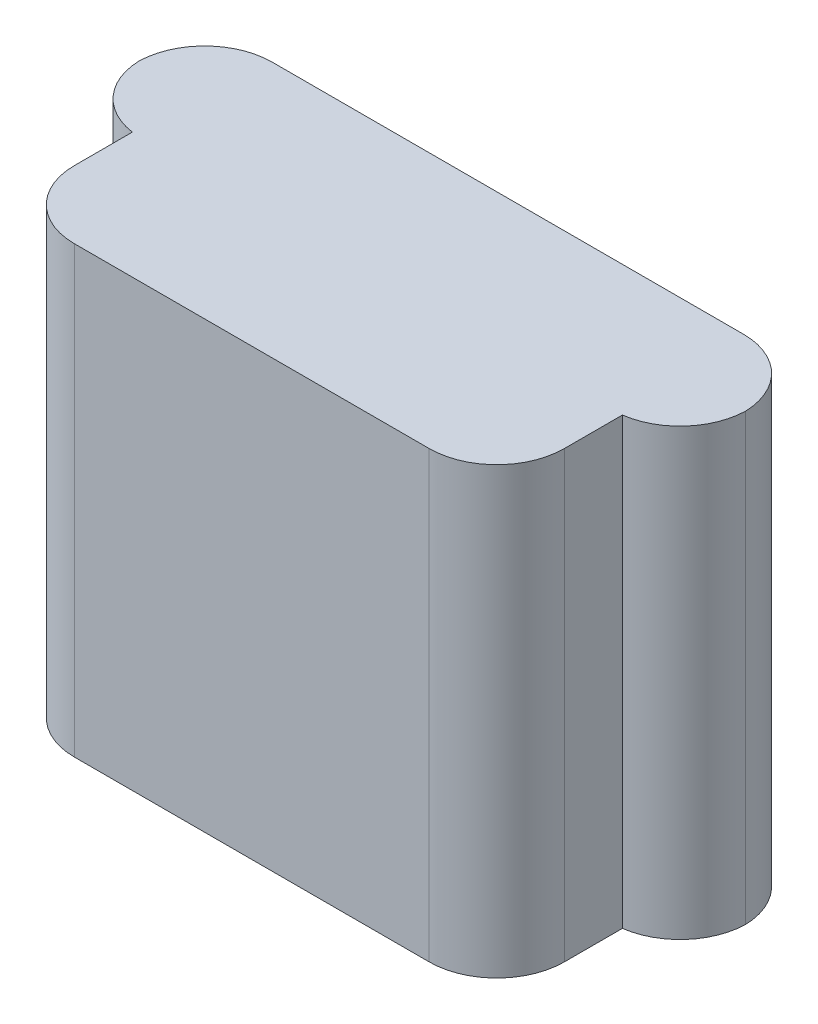
ISO-10303-21;
HEADER;
FILE_DESCRIPTION(('STEP AP214'),'2;1');
FILE_NAME('part.step','',(''),(''),'','','');
FILE_SCHEMA(('AUTOMOTIVE_DESIGN { 1 0 10303 214 1 1 1 1 }'));
ENDSEC;
DATA;
#1=APPLICATION_CONTEXT('core data for automotive mechanical design processes');
#2=APPLICATION_PROTOCOL_DEFINITION('international standard','automotive_design',2000,#1);
#3=PRODUCT_CONTEXT('',#1,'mechanical');
#4=PRODUCT('Part','Part','',(#3));
#5=PRODUCT_RELATED_PRODUCT_CATEGORY('part','',(#4));
#6=PRODUCT_DEFINITION_FORMATION('','',#4);
#7=PRODUCT_DEFINITION_CONTEXT('part definition',#1,'design');
#8=PRODUCT_DEFINITION('design','',#6,#7);
#9=PRODUCT_DEFINITION_SHAPE('','',#8);
#10=(LENGTH_UNIT() NAMED_UNIT(*) SI_UNIT(.MILLI.,.METRE.));
#11=(NAMED_UNIT(*) PLANE_ANGLE_UNIT() SI_UNIT($,.RADIAN.));
#12=(NAMED_UNIT(*) SI_UNIT($,.STERADIAN.) SOLID_ANGLE_UNIT());
#13=UNCERTAINTY_MEASURE_WITH_UNIT(LENGTH_MEASURE(1.E-05),#10,'distance_accuracy_value','');
#14=(GEOMETRIC_REPRESENTATION_CONTEXT(3) GLOBAL_UNCERTAINTY_ASSIGNED_CONTEXT((#13)) GLOBAL_UNIT_ASSIGNED_CONTEXT((#10,
#11,#12)) REPRESENTATION_CONTEXT('',''));
#15=CARTESIAN_POINT('',(0.,0.,0.));
#16=DIRECTION('',(0.,0.,1.));
#17=DIRECTION('',(1.,0.,0.));
#18=AXIS2_PLACEMENT_3D('',#15,#16,#17);
#19=CARTESIAN_POINT('',(45.6184,66.8782,-0.7366));
#20=DIRECTION('',(0.,1.,0.));
#21=DIRECTION('',(-1.,0.,0.));
#22=AXIS2_PLACEMENT_3D('',#19,#20,#21);
#23=PLANE('',#22);
#24=DIRECTION('',(-1.,0.,0.));
#25=VECTOR('',#24,1.);
#26=CARTESIAN_POINT('',(45.6184,66.8782,-0.7366));
#27=LINE('',#26,#25);
#28=CARTESIAN_POINT('',(35.4584,66.8782,-0.7366));
#29=VERTEX_POINT('',#28);
#30=CARTESIAN_POINT('',(-35.4584,66.8782,-0.7366));
#31=VERTEX_POINT('',#30);
#32=EDGE_CURVE('E200',#29,#31,#27,.T.);
#33=ORIENTED_EDGE('',*,*,#32,.T.);
#34=CARTESIAN_POINT('',(-35.4584,66.8782,9.42339999999997));
#35=DIRECTION('',(0.,1.,0.));
#36=DIRECTION('',(-1.,0.,0.));
#37=AXIS2_PLACEMENT_3D('',#34,#35,#36);
#38=CIRCLE('',#37,10.16);
#39=CARTESIAN_POINT('',(-45.6141265609793,66.8782,9.12875102474299));
#40=VERTEX_POINT('',#39);
#41=EDGE_CURVE('E146',#31,#40,#38,.T.);
#42=ORIENTED_EDGE('',*,*,#41,.T.);
#43=CARTESIAN_POINT('',(-35.4584,66.8782,8.834102049486));
#44=DIRECTION('',(0.,1.,0.));
#45=DIRECTION('',(-1.,0.,0.));
#46=AXIS2_PLACEMENT_3D('',#43,#44,#45);
#47=CIRCLE('',#46,10.16);
#48=CARTESIAN_POINT('',(-36.8554,66.8782,18.8976));
#49=VERTEX_POINT('',#48);
#50=EDGE_CURVE('E139',#40,#49,#47,.T.);
#51=ORIENTED_EDGE('',*,*,#50,.T.);
#52=DIRECTION('',(0.,0.,1.));
#53=VECTOR('',#52,1.);
#54=CARTESIAN_POINT('',(-36.8554,66.8782,18.8976));
#55=LINE('',#54,#53);
#56=CARTESIAN_POINT('',(-36.8554,66.8782,27.6352));
#57=VERTEX_POINT('',#56);
#58=EDGE_CURVE('E182',#49,#57,#55,.T.);
#59=ORIENTED_EDGE('',*,*,#58,.T.);
#60=CARTESIAN_POINT('',(-26.6954,66.8782,27.6352));
#61=DIRECTION('',(0.,1.,0.));
#62=DIRECTION('',(-1.,0.,0.));
#63=AXIS2_PLACEMENT_3D('',#60,#61,#62);
#64=CIRCLE('',#63,10.16);
#65=CARTESIAN_POINT('',(-26.6954,66.8782,37.7952));
#66=VERTEX_POINT('',#65);
#67=EDGE_CURVE('E141',#57,#66,#64,.T.);
#68=ORIENTED_EDGE('',*,*,#67,.T.);
#69=DIRECTION('',(-1.,0.,0.));
#70=VECTOR('',#69,1.);
#71=CARTESIAN_POINT('',(45.6184,66.8782,37.7952));
#72=LINE('',#71,#70);
#73=CARTESIAN_POINT('',(26.6954,66.8782,37.7952));
#74=VERTEX_POINT('',#73);
#75=EDGE_CURVE('E187',#74,#66,#72,.T.);
#76=ORIENTED_EDGE('',*,*,#75,.F.);
#77=CARTESIAN_POINT('',(26.6954,66.8782,27.6352));
#78=DIRECTION('',(0.,1.,0.));
#79=DIRECTION('',(-1.,0.,0.));
#80=AXIS2_PLACEMENT_3D('',#77,#78,#79);
#81=CIRCLE('',#80,10.16);
#82=CARTESIAN_POINT('',(36.8554,66.8782,27.6352));
#83=VERTEX_POINT('',#82);
#84=EDGE_CURVE('E132',#74,#83,#81,.T.);
#85=ORIENTED_EDGE('',*,*,#84,.T.);
#86=DIRECTION('',(0.,0.,1.));
#87=VECTOR('',#86,1.);
#88=CARTESIAN_POINT('',(36.8554,66.8782,18.8976));
#89=LINE('',#88,#87);
#90=CARTESIAN_POINT('',(36.8554,66.8782,18.8976));
#91=VERTEX_POINT('',#90);
#92=EDGE_CURVE('E119',#91,#83,#89,.T.);
#93=ORIENTED_EDGE('',*,*,#92,.F.);
#94=CARTESIAN_POINT('',(35.4584,66.8782,8.834102049486));
#95=DIRECTION('',(0.,1.,0.));
#96=DIRECTION('',(-1.,0.,0.));
#97=AXIS2_PLACEMENT_3D('',#94,#95,#96);
#98=CIRCLE('',#97,10.16);
#99=CARTESIAN_POINT('',(45.6141265609793,66.8782,9.12875102474311));
#100=VERTEX_POINT('',#99);
#101=EDGE_CURVE('E129',#91,#100,#98,.T.);
#102=ORIENTED_EDGE('',*,*,#101,.T.);
#103=CARTESIAN_POINT('',(35.4584,66.8782,9.42339999999997));
#104=DIRECTION('',(0.,1.,0.));
#105=DIRECTION('',(-1.,0.,0.));
#106=AXIS2_PLACEMENT_3D('',#103,#104,#105);
#107=CIRCLE('',#106,10.16);
#108=EDGE_CURVE('E137',#100,#29,#107,.T.);
#109=ORIENTED_EDGE('',*,*,#108,.T.);
#110=EDGE_LOOP('',(#33,#42,#51,#59,#68,#76,#85,#93,#102,#109));
#111=FACE_BOUND('',#110,.T.);
#112=ADVANCED_FACE('F36',(#111),#23,.T.);
#113=CARTESIAN_POINT('',(-45.6184,0.,-0.7366));
#114=DIRECTION('',(0.,-1.,0.));
#115=DIRECTION('',(1.,0.,0.));
#116=AXIS2_PLACEMENT_3D('',#113,#114,#115);
#117=PLANE('',#116);
#118=CARTESIAN_POINT('',(-35.4584,0.,8.834102049486));
#119=DIRECTION('',(0.,-1.,0.));
#120=DIRECTION('',(1.,0.,0.));
#121=AXIS2_PLACEMENT_3D('',#118,#119,#120);
#122=CIRCLE('',#121,10.16);
#123=CARTESIAN_POINT('',(-36.8554,0.,18.8976));
#124=VERTEX_POINT('',#123);
#125=CARTESIAN_POINT('',(-45.6141265609793,0.,9.12875102474299));
#126=VERTEX_POINT('',#125);
#127=EDGE_CURVE('E53',#124,#126,#122,.T.);
#128=ORIENTED_EDGE('',*,*,#127,.T.);
#129=CARTESIAN_POINT('',(-35.4584,0.,9.42339999999997));
#130=DIRECTION('',(0.,-1.,0.));
#131=DIRECTION('',(1.,0.,0.));
#132=AXIS2_PLACEMENT_3D('',#129,#130,#131);
#133=CIRCLE('',#132,10.16);
#134=CARTESIAN_POINT('',(-35.4584,0.,-0.7366));
#135=VERTEX_POINT('',#134);
#136=EDGE_CURVE('E162',#126,#135,#133,.T.);
#137=ORIENTED_EDGE('',*,*,#136,.T.);
#138=DIRECTION('',(1.,0.,0.));
#139=VECTOR('',#138,1.);
#140=CARTESIAN_POINT('',(-45.6184,0.,-0.7366));
#141=LINE('',#140,#139);
#142=CARTESIAN_POINT('',(35.4584,0.,-0.7366));
#143=VERTEX_POINT('',#142);
#144=EDGE_CURVE('E198',#135,#143,#141,.T.);
#145=ORIENTED_EDGE('',*,*,#144,.T.);
#146=CARTESIAN_POINT('',(35.4584,0.,9.42339999999997));
#147=DIRECTION('',(0.,-1.,0.));
#148=DIRECTION('',(1.,0.,0.));
#149=AXIS2_PLACEMENT_3D('',#146,#147,#148);
#150=CIRCLE('',#149,10.16);
#151=CARTESIAN_POINT('',(45.6141265609793,0.,9.12875102474299));
#152=VERTEX_POINT('',#151);
#153=EDGE_CURVE('E60',#143,#152,#150,.T.);
#154=ORIENTED_EDGE('',*,*,#153,.T.);
#155=CARTESIAN_POINT('',(35.4584,0.,8.834102049486));
#156=DIRECTION('',(0.,-1.,0.));
#157=DIRECTION('',(1.,0.,0.));
#158=AXIS2_PLACEMENT_3D('',#155,#156,#157);
#159=CIRCLE('',#158,10.16);
#160=CARTESIAN_POINT('',(36.8554,0.,18.8976));
#161=VERTEX_POINT('',#160);
#162=EDGE_CURVE('E158',#152,#161,#159,.T.);
#163=ORIENTED_EDGE('',*,*,#162,.T.);
#164=DIRECTION('',(0.,0.,1.));
#165=VECTOR('',#164,1.);
#166=CARTESIAN_POINT('',(36.8554,0.,18.8976));
#167=LINE('',#166,#165);
#168=CARTESIAN_POINT('',(36.8554,0.,27.6352));
#169=VERTEX_POINT('',#168);
#170=EDGE_CURVE('E122',#161,#169,#167,.T.);
#171=ORIENTED_EDGE('',*,*,#170,.T.);
#172=CARTESIAN_POINT('',(26.6954,0.,27.6352));
#173=DIRECTION('',(0.,-1.,0.));
#174=DIRECTION('',(1.,0.,0.));
#175=AXIS2_PLACEMENT_3D('',#172,#173,#174);
#176=CIRCLE('',#175,10.16);
#177=CARTESIAN_POINT('',(26.6954,0.,37.7952));
#178=VERTEX_POINT('',#177);
#179=EDGE_CURVE('E156',#169,#178,#176,.T.);
#180=ORIENTED_EDGE('',*,*,#179,.T.);
#181=DIRECTION('',(1.,0.,0.));
#182=VECTOR('',#181,1.);
#183=CARTESIAN_POINT('',(-45.6184,0.,37.7952));
#184=LINE('',#183,#182);
#185=CARTESIAN_POINT('',(-26.6954,0.,37.7952));
#186=VERTEX_POINT('',#185);
#187=EDGE_CURVE('E191',#186,#178,#184,.T.);
#188=ORIENTED_EDGE('',*,*,#187,.F.);
#189=CARTESIAN_POINT('',(-26.6954,0.,27.6352));
#190=DIRECTION('',(0.,-1.,0.));
#191=DIRECTION('',(1.,0.,0.));
#192=AXIS2_PLACEMENT_3D('',#189,#190,#191);
#193=CIRCLE('',#192,10.16);
#194=CARTESIAN_POINT('',(-36.8554,0.,27.6352));
#195=VERTEX_POINT('',#194);
#196=EDGE_CURVE('E154',#186,#195,#193,.T.);
#197=ORIENTED_EDGE('',*,*,#196,.T.);
#198=DIRECTION('',(0.,0.,1.));
#199=VECTOR('',#198,1.);
#200=CARTESIAN_POINT('',(-36.8554,0.,18.8976));
#201=LINE('',#200,#199);
#202=EDGE_CURVE('E188',#124,#195,#201,.T.);
#203=ORIENTED_EDGE('',*,*,#202,.F.);
#204=EDGE_LOOP('',(#128,#137,#145,#154,#163,#171,#180,#188,#197,#203));
#205=FACE_BOUND('',#204,.T.);
#206=ADVANCED_FACE('F208',(#205),#117,.T.);
#207=CARTESIAN_POINT('',(0.,0.,37.7952));
#208=DIRECTION('',(0.,0.,1.));
#209=DIRECTION('',(1.,0.,0.));
#210=AXIS2_PLACEMENT_3D('',#207,#208,#209);
#211=PLANE('',#210);
#212=ORIENTED_EDGE('',*,*,#187,.T.);
#213=DIRECTION('',(0.,1.,0.));
#214=VECTOR('',#213,1.);
#215=CARTESIAN_POINT('',(26.6954,0.,37.7952));
#216=LINE('',#215,#214);
#217=EDGE_CURVE('E166',#178,#74,#216,.T.);
#218=ORIENTED_EDGE('',*,*,#217,.T.);
#219=ORIENTED_EDGE('',*,*,#75,.T.);
#220=DIRECTION('',(0.,1.,0.));
#221=VECTOR('',#220,1.);
#222=CARTESIAN_POINT('',(-26.6954,0.,37.7952));
#223=LINE('',#222,#221);
#224=EDGE_CURVE('E164',#66,#186,#223,.F.);
#225=ORIENTED_EDGE('',*,*,#224,.T.);
#226=EDGE_LOOP('',(#212,#218,#219,#225));
#227=FACE_BOUND('',#226,.T.);
#228=ADVANCED_FACE('F204',(#227),#211,.T.);
#229=CARTESIAN_POINT('',(0.,0.,-0.7366));
#230=DIRECTION('',(0.,0.,1.));
#231=DIRECTION('',(1.,0.,0.));
#232=AXIS2_PLACEMENT_3D('',#229,#230,#231);
#233=PLANE('',#232);
#234=ORIENTED_EDGE('',*,*,#32,.F.);
#235=DIRECTION('',(0.,1.,0.));
#236=VECTOR('',#235,1.);
#237=CARTESIAN_POINT('',(35.4584,0.,-0.7366));
#238=LINE('',#237,#236);
#239=EDGE_CURVE('E151',#29,#143,#238,.F.);
#240=ORIENTED_EDGE('',*,*,#239,.T.);
#241=ORIENTED_EDGE('',*,*,#144,.F.);
#242=DIRECTION('',(0.,-1.,0.));
#243=VECTOR('',#242,1.);
#244=CARTESIAN_POINT('',(-35.4584,66.8782,-0.7366));
#245=LINE('',#244,#243);
#246=EDGE_CURVE('E148',#135,#31,#245,.F.);
#247=ORIENTED_EDGE('',*,*,#246,.T.);
#248=EDGE_LOOP('',(#234,#240,#241,#247));
#249=FACE_BOUND('',#248,.T.);
#250=ADVANCED_FACE('F227',(#249),#233,.F.);
#251=CARTESIAN_POINT('',(-36.8554,66.8782,18.8976));
#252=DIRECTION('',(1.,0.,0.));
#253=DIRECTION('',(0.,1.,0.));
#254=AXIS2_PLACEMENT_3D('',#251,#252,#253);
#255=PLANE('',#254);
#256=ORIENTED_EDGE('',*,*,#202,.T.);
#257=DIRECTION('',(0.,1.,0.));
#258=VECTOR('',#257,1.);
#259=CARTESIAN_POINT('',(-36.8554,66.8782,27.6352));
#260=LINE('',#259,#258);
#261=EDGE_CURVE('E11',#195,#57,#260,.T.);
#262=ORIENTED_EDGE('',*,*,#261,.T.);
#263=ORIENTED_EDGE('',*,*,#58,.F.);
#264=DIRECTION('',(0.,1.,0.));
#265=VECTOR('',#264,1.);
#266=CARTESIAN_POINT('',(-36.8554,66.8782,18.8976));
#267=LINE('',#266,#265);
#268=EDGE_CURVE('E179',#124,#49,#267,.T.);
#269=ORIENTED_EDGE('',*,*,#268,.F.);
#270=EDGE_LOOP('',(#256,#262,#263,#269));
#271=FACE_BOUND('',#270,.T.);
#272=ADVANCED_FACE('F185',(#271),#255,.F.);
#273=CARTESIAN_POINT('',(36.8554,66.8782,18.8976));
#274=DIRECTION('',(1.,0.,0.));
#275=DIRECTION('',(0.,1.,0.));
#276=AXIS2_PLACEMENT_3D('',#273,#274,#275);
#277=PLANE('',#276);
#278=ORIENTED_EDGE('',*,*,#92,.T.);
#279=DIRECTION('',(0.,1.,0.));
#280=VECTOR('',#279,1.);
#281=CARTESIAN_POINT('',(36.8554,66.8782,27.6352));
#282=LINE('',#281,#280);
#283=EDGE_CURVE('E45',#83,#169,#282,.F.);
#284=ORIENTED_EDGE('',*,*,#283,.T.);
#285=ORIENTED_EDGE('',*,*,#170,.F.);
#286=DIRECTION('',(0.,1.,0.));
#287=VECTOR('',#286,1.);
#288=CARTESIAN_POINT('',(36.8554,66.8782,18.8976));
#289=LINE('',#288,#287);
#290=EDGE_CURVE('E116',#161,#91,#289,.T.);
#291=ORIENTED_EDGE('',*,*,#290,.T.);
#292=EDGE_LOOP('',(#278,#284,#285,#291));
#293=FACE_BOUND('',#292,.T.);
#294=ADVANCED_FACE('F118',(#293),#277,.T.);
#295=CARTESIAN_POINT('',(35.4584,0.,8.834102049486));
#296=DIRECTION('',(0.,-1.,0.));
#297=DIRECTION('',(1.,0.,0.));
#298=AXIS2_PLACEMENT_3D('',#295,#296,#297);
#299=CYLINDRICAL_SURFACE('',#298,10.16);
#300=ORIENTED_EDGE('',*,*,#290,.F.);
#301=ORIENTED_EDGE('',*,*,#162,.F.);
#302=DIRECTION('',(0.,-1.,0.));
#303=VECTOR('',#302,1.);
#304=CARTESIAN_POINT('',(45.6141265609793,33.4391,9.12875102474311));
#305=LINE('',#304,#303);
#306=EDGE_CURVE('E125',#100,#152,#305,.T.);
#307=ORIENTED_EDGE('',*,*,#306,.F.);
#308=ORIENTED_EDGE('',*,*,#101,.F.);
#309=EDGE_LOOP('',(#300,#301,#307,#308));
#310=FACE_BOUND('',#309,.T.);
#311=ADVANCED_FACE('F134',(#310),#299,.T.);
#312=CARTESIAN_POINT('',(35.4584,0.,9.42339999999997));
#313=DIRECTION('',(0.,-1.,0.));
#314=DIRECTION('',(0.,0.,-1.));
#315=AXIS2_PLACEMENT_3D('',#312,#313,#314);
#316=CYLINDRICAL_SURFACE('',#315,10.16);
#317=ORIENTED_EDGE('',*,*,#153,.F.);
#318=ORIENTED_EDGE('',*,*,#239,.F.);
#319=ORIENTED_EDGE('',*,*,#108,.F.);
#320=ORIENTED_EDGE('',*,*,#306,.T.);
#321=EDGE_LOOP('',(#317,#318,#319,#320));
#322=FACE_BOUND('',#321,.T.);
#323=ADVANCED_FACE('F230',(#322),#316,.T.);
#324=CARTESIAN_POINT('',(-35.4584,0.,8.834102049486));
#325=DIRECTION('',(0.,-1.,0.));
#326=DIRECTION('',(1.,0.,0.));
#327=AXIS2_PLACEMENT_3D('',#324,#325,#326);
#328=CYLINDRICAL_SURFACE('',#327,10.16);
#329=ORIENTED_EDGE('',*,*,#268,.T.);
#330=ORIENTED_EDGE('',*,*,#50,.F.);
#331=DIRECTION('',(0.,-1.,0.));
#332=VECTOR('',#331,1.);
#333=CARTESIAN_POINT('',(-45.6141265609793,33.4391,9.12875102474311));
#334=LINE('',#333,#332);
#335=EDGE_CURVE('E40',#126,#40,#334,.F.);
#336=ORIENTED_EDGE('',*,*,#335,.F.);
#337=ORIENTED_EDGE('',*,*,#127,.F.);
#338=EDGE_LOOP('',(#329,#330,#336,#337));
#339=FACE_BOUND('',#338,.T.);
#340=ADVANCED_FACE('F178',(#339),#328,.T.);
#341=CARTESIAN_POINT('',(-35.4584,66.8782,9.42339999999997));
#342=DIRECTION('',(0.,1.,0.));
#343=DIRECTION('',(-1.,0.,0.));
#344=AXIS2_PLACEMENT_3D('',#341,#342,#343);
#345=CYLINDRICAL_SURFACE('',#344,10.16);
#346=ORIENTED_EDGE('',*,*,#41,.F.);
#347=ORIENTED_EDGE('',*,*,#246,.F.);
#348=ORIENTED_EDGE('',*,*,#136,.F.);
#349=ORIENTED_EDGE('',*,*,#335,.T.);
#350=EDGE_LOOP('',(#346,#347,#348,#349));
#351=FACE_BOUND('',#350,.T.);
#352=ADVANCED_FACE('F173',(#351),#345,.T.);
#353=CARTESIAN_POINT('',(26.6954,0.,27.6352));
#354=DIRECTION('',(0.,1.,0.));
#355=DIRECTION('',(-1.,0.,0.));
#356=AXIS2_PLACEMENT_3D('',#353,#354,#355);
#357=CYLINDRICAL_SURFACE('',#356,10.16);
#358=ORIENTED_EDGE('',*,*,#179,.F.);
#359=ORIENTED_EDGE('',*,*,#283,.F.);
#360=ORIENTED_EDGE('',*,*,#84,.F.);
#361=ORIENTED_EDGE('',*,*,#217,.F.);
#362=EDGE_LOOP('',(#358,#359,#360,#361));
#363=FACE_BOUND('',#362,.T.);
#364=ADVANCED_FACE('F211',(#363),#357,.T.);
#365=CARTESIAN_POINT('',(-26.6954,66.8782,27.6352));
#366=DIRECTION('',(0.,-1.,0.));
#367=DIRECTION('',(1.,0.,0.));
#368=AXIS2_PLACEMENT_3D('',#365,#366,#367);
#369=CYLINDRICAL_SURFACE('',#368,10.16);
#370=ORIENTED_EDGE('',*,*,#196,.F.);
#371=ORIENTED_EDGE('',*,*,#224,.F.);
#372=ORIENTED_EDGE('',*,*,#67,.F.);
#373=ORIENTED_EDGE('',*,*,#261,.F.);
#374=EDGE_LOOP('',(#370,#371,#372,#373));
#375=FACE_BOUND('',#374,.T.);
#376=ADVANCED_FACE('F38',(#375),#369,.T.);
#377=CLOSED_SHELL('',(#112,#206,#228,#250,#272,#294,#311,#323,#340,#352,#364,#376));
#378=MANIFOLD_SOLID_BREP('B2',#377);
#379=ADVANCED_BREP_SHAPE_REPRESENTATION('',(#18,#378),#14);
#380=SHAPE_DEFINITION_REPRESENTATION(#9,#379);
ENDSEC;
END-ISO-10303-21;
